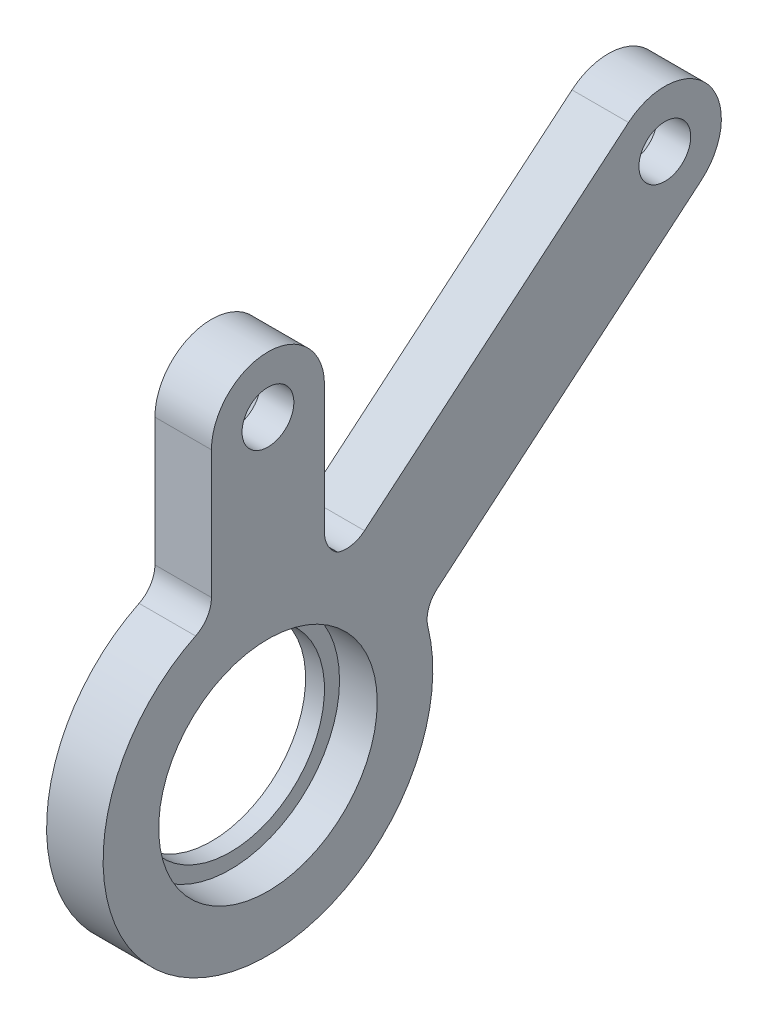
ISO-10303-21;
HEADER;
FILE_DESCRIPTION(('STEP AP214'),'2;1');
FILE_NAME('part.step','',(''),(''),'','','');
FILE_SCHEMA(('AUTOMOTIVE_DESIGN { 1 0 10303 214 1 1 1 1 }'));
ENDSEC;
DATA;
#1=APPLICATION_CONTEXT('core data for automotive mechanical design processes');
#2=APPLICATION_PROTOCOL_DEFINITION('international standard','automotive_design',2000,#1);
#3=PRODUCT_CONTEXT('',#1,'mechanical');
#4=PRODUCT('Part','Part','',(#3));
#5=PRODUCT_RELATED_PRODUCT_CATEGORY('part','',(#4));
#6=PRODUCT_DEFINITION_FORMATION('','',#4);
#7=PRODUCT_DEFINITION_CONTEXT('part definition',#1,'design');
#8=PRODUCT_DEFINITION('design','',#6,#7);
#9=PRODUCT_DEFINITION_SHAPE('','',#8);
#10=(LENGTH_UNIT() NAMED_UNIT(*) SI_UNIT(.MILLI.,.METRE.));
#11=(NAMED_UNIT(*) PLANE_ANGLE_UNIT() SI_UNIT($,.RADIAN.));
#12=(NAMED_UNIT(*) SI_UNIT($,.STERADIAN.) SOLID_ANGLE_UNIT());
#13=UNCERTAINTY_MEASURE_WITH_UNIT(LENGTH_MEASURE(1.E-05),#10,'distance_accuracy_value','');
#14=(GEOMETRIC_REPRESENTATION_CONTEXT(3) GLOBAL_UNCERTAINTY_ASSIGNED_CONTEXT((#13)) GLOBAL_UNIT_ASSIGNED_CONTEXT((#10,
#11,#12)) REPRESENTATION_CONTEXT('',''));
#15=CARTESIAN_POINT('',(0.,0.,0.));
#16=DIRECTION('',(0.,0.,1.));
#17=DIRECTION('',(1.,0.,0.));
#18=AXIS2_PLACEMENT_3D('',#15,#16,#17);
#19=CARTESIAN_POINT('',(-2.,0.,0.));
#20=DIRECTION('',(1.,0.,0.));
#21=DIRECTION('',(0.,0.,-1.));
#22=AXIS2_PLACEMENT_3D('',#19,#20,#21);
#23=CYLINDRICAL_SURFACE('',#22,11.6);
#24=CARTESIAN_POINT('',(4.,0.,0.));
#25=DIRECTION('',(1.,0.,0.));
#26=DIRECTION('',(0.,0.,-1.));
#27=AXIS2_PLACEMENT_3D('',#24,#25,#26);
#28=CIRCLE('',#27,11.6);
#29=CARTESIAN_POINT('',(4.,0.,-11.6));
#30=VERTEX_POINT('',#29);
#31=EDGE_CURVE('E161',#30,#30,#28,.T.);
#32=ORIENTED_EDGE('',*,*,#31,.T.);
#33=EDGE_LOOP('',(#32));
#34=FACE_BOUND('',#33,.T.);
#35=CARTESIAN_POINT('',(0.,0.,0.));
#36=DIRECTION('',(-1.,0.,0.));
#37=DIRECTION('',(0.,0.,1.));
#38=AXIS2_PLACEMENT_3D('',#35,#36,#37);
#39=CIRCLE('',#38,11.6);
#40=CARTESIAN_POINT('',(0.,0.,11.6));
#41=VERTEX_POINT('',#40);
#42=EDGE_CURVE('E11',#41,#41,#39,.F.);
#43=ORIENTED_EDGE('',*,*,#42,.F.);
#44=EDGE_LOOP('',(#43));
#45=FACE_BOUND('',#44,.T.);
#46=ADVANCED_FACE('F35',(#34,#45),#23,.F.);
#47=CARTESIAN_POINT('',(-2.,0.,0.));
#48=DIRECTION('',(1.,0.,0.));
#49=DIRECTION('',(0.,0.,-1.));
#50=AXIS2_PLACEMENT_3D('',#47,#48,#49);
#51=PLANE('',#50);
#52=DIRECTION('',(0.,-1.,0.));
#53=VECTOR('',#52,1.);
#54=CARTESIAN_POINT('',(-2.,0.,-5.99999999999999));
#55=LINE('',#54,#53);
#56=CARTESIAN_POINT('',(-2.,32.,-6.));
#57=VERTEX_POINT('',#56);
#58=CARTESIAN_POINT('',(-2.,18.4187404563939,-6.));
#59=VERTEX_POINT('',#58);
#60=EDGE_CURVE('E132',#57,#59,#55,.T.);
#61=ORIENTED_EDGE('',*,*,#60,.T.);
#62=CARTESIAN_POINT('',(-2.,18.4187404563939,-9.));
#63=DIRECTION('',(1.,0.,0.));
#64=DIRECTION('',(0.,0.,-1.));
#65=AXIS2_PLACEMENT_3D('',#62,#63,#64);
#66=CIRCLE('',#65,3.);
#67=CARTESIAN_POINT('',(-2.,15.8783764006959,-7.40420851471203));
#68=VERTEX_POINT('',#67);
#69=EDGE_CURVE('E58',#59,#68,#66,.T.);
#70=ORIENTED_EDGE('',*,*,#69,.T.);
#71=CARTESIAN_POINT('',(-2.,18.733738139473,-8.32448528869227));
#72=DIRECTION('',(1.,0.,0.));
#73=DIRECTION('',(0.,0.,-1.));
#74=AXIS2_PLACEMENT_3D('',#71,#72,#73);
#75=CIRCLE('',#74,3.);
#76=CARTESIAN_POINT('',(-2.,16.4356048101161,-10.2528481177519));
#77=VERTEX_POINT('',#76);
#78=EDGE_CURVE('E203',#68,#77,#75,.T.);
#79=ORIENTED_EDGE('',*,*,#78,.T.);
#80=DIRECTION('',(0.,-0.642787609686543,0.766044443118975));
#81=VECTOR('',#80,1.);
#82=CARTESIAN_POINT('',(-2.,4.59626665871385,3.85672565811926));
#83=LINE('',#82,#81);
#84=CARTESIAN_POINT('',(-2.,39.9495851914737,-38.2757187134243));
#85=VERTEX_POINT('',#84);
#86=EDGE_CURVE('E158',#85,#77,#83,.T.);
#87=ORIENTED_EDGE('',*,*,#86,.F.);
#88=CARTESIAN_POINT('',(-2.,35.3533185327599,-42.1324443715436));
#89=DIRECTION('',(-1.,0.,0.));
#90=DIRECTION('',(0.,0.,1.));
#91=AXIS2_PLACEMENT_3D('',#88,#89,#90);
#92=CIRCLE('',#91,6.);
#93=CARTESIAN_POINT('',(-2.,30.757051874046,-45.9891700296629));
#94=VERTEX_POINT('',#93);
#95=EDGE_CURVE('E154',#85,#94,#92,.T.);
#96=ORIENTED_EDGE('',*,*,#95,.T.);
#97=DIRECTION('',(0.,-0.642787609686543,0.766044443118975));
#98=VECTOR('',#97,1.);
#99=CARTESIAN_POINT('',(-2.,-4.59626665871384,-3.85672565811925));
#100=LINE('',#99,#98);
#101=CARTESIAN_POINT('',(-2.,7.24307149268841,-17.9662994339904));
#102=VERTEX_POINT('',#101);
#103=EDGE_CURVE('E150',#94,#102,#100,.T.);
#104=ORIENTED_EDGE('',*,*,#103,.T.);
#105=CARTESIAN_POINT('',(-2.,4.94493816333148,-19.8946622630501));
#106=DIRECTION('',(1.,0.,0.));
#107=DIRECTION('',(0.,0.,-1.));
#108=AXIS2_PLACEMENT_3D('',#105,#106,#107);
#109=CIRCLE('',#108,3.);
#110=CARTESIAN_POINT('',(-2.,4.22128867601468,-16.9832482733354));
#111=VERTEX_POINT('',#110);
#112=EDGE_CURVE('E199',#102,#111,#109,.T.);
#113=ORIENTED_EDGE('',*,*,#112,.T.);
#114=CARTESIAN_POINT('',(-2.,0.,0.));
#115=DIRECTION('',(1.,0.,0.));
#116=DIRECTION('',(0.,0.,-1.));
#117=AXIS2_PLACEMENT_3D('',#114,#115,#116);
#118=CIRCLE('',#117,17.5);
#119=CARTESIAN_POINT('',(-2.,15.7233150237509,7.6829268292683));
#120=VERTEX_POINT('',#119);
#121=EDGE_CURVE('E177',#120,#111,#118,.T.);
#122=ORIENTED_EDGE('',*,*,#121,.F.);
#123=CARTESIAN_POINT('',(-2.,18.4187404563939,9.00000000000001));
#124=DIRECTION('',(1.,0.,0.));
#125=DIRECTION('',(0.,0.,-1.));
#126=AXIS2_PLACEMENT_3D('',#123,#124,#125);
#127=CIRCLE('',#126,3.);
#128=CARTESIAN_POINT('',(-2.,18.4187404563939,6.));
#129=VERTEX_POINT('',#128);
#130=EDGE_CURVE('E195',#120,#129,#127,.T.);
#131=ORIENTED_EDGE('',*,*,#130,.T.);
#132=DIRECTION('',(0.,-1.,0.));
#133=VECTOR('',#132,1.);
#134=CARTESIAN_POINT('',(-2.,0.,6.00000000000001));
#135=LINE('',#134,#133);
#136=CARTESIAN_POINT('',(-2.,32.,6.));
#137=VERTEX_POINT('',#136);
#138=EDGE_CURVE('E144',#137,#129,#135,.T.);
#139=ORIENTED_EDGE('',*,*,#138,.F.);
#140=CARTESIAN_POINT('',(-2.,32.,0.));
#141=DIRECTION('',(-1.,0.,0.));
#142=DIRECTION('',(0.,0.,1.));
#143=AXIS2_PLACEMENT_3D('',#140,#141,#142);
#144=CIRCLE('',#143,6.);
#145=EDGE_CURVE('E140',#137,#57,#144,.T.);
#146=ORIENTED_EDGE('',*,*,#145,.T.);
#147=EDGE_LOOP('',(#61,#70,#79,#87,#96,#104,#113,#122,#131,#139,#146));
#148=FACE_BOUND('',#147,.T.);
#149=CARTESIAN_POINT('',(-2.,35.3533185327599,-42.1324443715436));
#150=DIRECTION('',(-1.,0.,0.));
#151=DIRECTION('',(0.,0.,1.));
#152=AXIS2_PLACEMENT_3D('',#149,#150,#151);
#153=CIRCLE('',#152,5.2);
#154=CARTESIAN_POINT('',(-2.,35.3533185327599,-36.9324443715436));
#155=VERTEX_POINT('',#154);
#156=EDGE_CURVE('E229',#155,#155,#153,.T.);
#157=ORIENTED_EDGE('',*,*,#156,.F.);
#158=EDGE_LOOP('',(#157));
#159=FACE_BOUND('',#158,.T.);
#160=CARTESIAN_POINT('',(-2.,32.,0.));
#161=DIRECTION('',(-1.,0.,0.));
#162=DIRECTION('',(0.,0.,1.));
#163=AXIS2_PLACEMENT_3D('',#160,#161,#162);
#164=CIRCLE('',#163,5.2);
#165=CARTESIAN_POINT('',(-2.,32.,5.2));
#166=VERTEX_POINT('',#165);
#167=EDGE_CURVE('E209',#166,#166,#164,.T.);
#168=ORIENTED_EDGE('',*,*,#167,.F.);
#169=EDGE_LOOP('',(#168));
#170=FACE_BOUND('',#169,.T.);
#171=CARTESIAN_POINT('',(-2.,0.,0.));
#172=DIRECTION('',(-1.,0.,0.));
#173=DIRECTION('',(0.,0.,1.));
#174=AXIS2_PLACEMENT_3D('',#171,#172,#173);
#175=CIRCLE('',#174,10.);
#176=CARTESIAN_POINT('',(-2.,0.,10.));
#177=VERTEX_POINT('',#176);
#178=EDGE_CURVE('E217',#177,#177,#175,.T.);
#179=ORIENTED_EDGE('',*,*,#178,.F.);
#180=EDGE_LOOP('',(#179));
#181=FACE_BOUND('',#180,.T.);
#182=ADVANCED_FACE('F237',(#148,#159,#170,#181),#51,.F.);
#183=CARTESIAN_POINT('',(-2.,0.,0.));
#184=DIRECTION('',(1.,0.,0.));
#185=DIRECTION('',(0.,0.,-1.));
#186=AXIS2_PLACEMENT_3D('',#183,#184,#185);
#187=CYLINDRICAL_SURFACE('',#186,17.5);
#188=CARTESIAN_POINT('',(4.,0.,0.));
#189=DIRECTION('',(1.,0.,0.));
#190=DIRECTION('',(0.,0.,-1.));
#191=AXIS2_PLACEMENT_3D('',#188,#189,#190);
#192=CIRCLE('',#191,17.5);
#193=CARTESIAN_POINT('',(4.,15.7233150237509,7.6829268292683));
#194=VERTEX_POINT('',#193);
#195=CARTESIAN_POINT('',(4.,4.22128867601468,-16.9832482733354));
#196=VERTEX_POINT('',#195);
#197=EDGE_CURVE('E174',#194,#196,#192,.T.);
#198=ORIENTED_EDGE('',*,*,#197,.F.);
#199=DIRECTION('',(1.,0.,0.));
#200=VECTOR('',#199,1.);
#201=CARTESIAN_POINT('',(-2.,15.7233150237509,7.6829268292683));
#202=LINE('',#201,#200);
#203=EDGE_CURVE('E182',#194,#120,#202,.F.);
#204=ORIENTED_EDGE('',*,*,#203,.T.);
#205=ORIENTED_EDGE('',*,*,#121,.T.);
#206=DIRECTION('',(1.,0.,0.));
#207=VECTOR('',#206,1.);
#208=CARTESIAN_POINT('',(-2.,4.22128867601468,-16.9832482733354));
#209=LINE('',#208,#207);
#210=EDGE_CURVE('E180',#111,#196,#209,.T.);
#211=ORIENTED_EDGE('',*,*,#210,.T.);
#212=EDGE_LOOP('',(#198,#204,#205,#211));
#213=FACE_BOUND('',#212,.T.);
#214=ADVANCED_FACE('F251',(#213),#187,.T.);
#215=CARTESIAN_POINT('',(4.,0.,0.));
#216=DIRECTION('',(1.,0.,0.));
#217=DIRECTION('',(0.,0.,-1.));
#218=AXIS2_PLACEMENT_3D('',#215,#216,#217);
#219=PLANE('',#218);
#220=CARTESIAN_POINT('',(4.,32.,0.));
#221=DIRECTION('',(1.,0.,0.));
#222=DIRECTION('',(0.,0.,-1.));
#223=AXIS2_PLACEMENT_3D('',#220,#221,#222);
#224=CIRCLE('',#223,2.75);
#225=CARTESIAN_POINT('',(4.,32.,-2.75));
#226=VERTEX_POINT('',#225);
#227=EDGE_CURVE('E226',#226,#226,#224,.T.);
#228=ORIENTED_EDGE('',*,*,#227,.F.);
#229=EDGE_LOOP('',(#228));
#230=FACE_BOUND('',#229,.T.);
#231=CARTESIAN_POINT('',(4.,35.3533185327599,-42.1324443715436));
#232=DIRECTION('',(1.,0.,0.));
#233=DIRECTION('',(0.,0.,-1.));
#234=AXIS2_PLACEMENT_3D('',#231,#232,#233);
#235=CIRCLE('',#234,2.75);
#236=CARTESIAN_POINT('',(4.,35.3533185327599,-44.8824443715436));
#237=VERTEX_POINT('',#236);
#238=EDGE_CURVE('E147',#237,#237,#235,.T.);
#239=ORIENTED_EDGE('',*,*,#238,.F.);
#240=EDGE_LOOP('',(#239));
#241=FACE_BOUND('',#240,.T.);
#242=CARTESIAN_POINT('',(4.,18.733738139473,-8.32448528869227));
#243=DIRECTION('',(1.,0.,0.));
#244=DIRECTION('',(0.,0.,-1.));
#245=AXIS2_PLACEMENT_3D('',#242,#243,#244);
#246=CIRCLE('',#245,3.);
#247=CARTESIAN_POINT('',(4.,16.4356048101161,-10.2528481177519));
#248=VERTEX_POINT('',#247);
#249=CARTESIAN_POINT('',(4.,15.8783764006959,-7.40420851471203));
#250=VERTEX_POINT('',#249);
#251=EDGE_CURVE('E50',#248,#250,#246,.F.);
#252=ORIENTED_EDGE('',*,*,#251,.T.);
#253=CARTESIAN_POINT('',(4.,18.4187404563939,-9.));
#254=DIRECTION('',(1.,0.,0.));
#255=DIRECTION('',(0.,0.,-1.));
#256=AXIS2_PLACEMENT_3D('',#253,#254,#255);
#257=CIRCLE('',#256,3.);
#258=CARTESIAN_POINT('',(4.,18.4187404563939,-6.));
#259=VERTEX_POINT('',#258);
#260=EDGE_CURVE('E43',#250,#259,#257,.F.);
#261=ORIENTED_EDGE('',*,*,#260,.T.);
#262=DIRECTION('',(0.,-1.,0.));
#263=VECTOR('',#262,1.);
#264=CARTESIAN_POINT('',(4.,0.,-5.99999999999999));
#265=LINE('',#264,#263);
#266=CARTESIAN_POINT('',(4.,32.,-6.));
#267=VERTEX_POINT('',#266);
#268=EDGE_CURVE('E117',#267,#259,#265,.T.);
#269=ORIENTED_EDGE('',*,*,#268,.F.);
#270=CARTESIAN_POINT('',(4.,32.,0.));
#271=DIRECTION('',(1.,0.,0.));
#272=DIRECTION('',(0.,0.,-1.));
#273=AXIS2_PLACEMENT_3D('',#270,#271,#272);
#274=CIRCLE('',#273,6.);
#275=CARTESIAN_POINT('',(4.,32.,6.));
#276=VERTEX_POINT('',#275);
#277=EDGE_CURVE('E123',#276,#267,#274,.F.);
#278=ORIENTED_EDGE('',*,*,#277,.F.);
#279=DIRECTION('',(0.,-1.,0.));
#280=VECTOR('',#279,1.);
#281=CARTESIAN_POINT('',(4.,0.,6.00000000000001));
#282=LINE('',#281,#280);
#283=CARTESIAN_POINT('',(4.,18.4187404563939,6.));
#284=VERTEX_POINT('',#283);
#285=EDGE_CURVE('E146',#276,#284,#282,.T.);
#286=ORIENTED_EDGE('',*,*,#285,.T.);
#287=CARTESIAN_POINT('',(4.,18.4187404563939,9.00000000000001));
#288=DIRECTION('',(1.,0.,0.));
#289=DIRECTION('',(0.,0.,-1.));
#290=AXIS2_PLACEMENT_3D('',#287,#288,#289);
#291=CIRCLE('',#290,3.);
#292=EDGE_CURVE('E197',#284,#194,#291,.F.);
#293=ORIENTED_EDGE('',*,*,#292,.T.);
#294=ORIENTED_EDGE('',*,*,#197,.T.);
#295=CARTESIAN_POINT('',(4.,4.94493816333148,-19.8946622630501));
#296=DIRECTION('',(1.,0.,0.));
#297=DIRECTION('',(0.,0.,-1.));
#298=AXIS2_PLACEMENT_3D('',#295,#296,#297);
#299=CIRCLE('',#298,3.);
#300=CARTESIAN_POINT('',(4.,7.24307149268841,-17.9662994339904));
#301=VERTEX_POINT('',#300);
#302=EDGE_CURVE('E201',#196,#301,#299,.F.);
#303=ORIENTED_EDGE('',*,*,#302,.T.);
#304=DIRECTION('',(0.,-0.642787609686543,0.766044443118975));
#305=VECTOR('',#304,1.);
#306=CARTESIAN_POINT('',(4.,-4.59626665871384,-3.85672565811925));
#307=LINE('',#306,#305);
#308=CARTESIAN_POINT('',(4.,30.757051874046,-45.9891700296629));
#309=VERTEX_POINT('',#308);
#310=EDGE_CURVE('E167',#309,#301,#307,.T.);
#311=ORIENTED_EDGE('',*,*,#310,.F.);
#312=CARTESIAN_POINT('',(4.,35.3533185327599,-42.1324443715436));
#313=DIRECTION('',(1.,0.,0.));
#314=DIRECTION('',(0.,0.,-1.));
#315=AXIS2_PLACEMENT_3D('',#312,#313,#314);
#316=CIRCLE('',#315,6.);
#317=CARTESIAN_POINT('',(4.,39.9495851914737,-38.2757187134243));
#318=VERTEX_POINT('',#317);
#319=EDGE_CURVE('E153',#318,#309,#316,.F.);
#320=ORIENTED_EDGE('',*,*,#319,.F.);
#321=DIRECTION('',(0.,-0.642787609686543,0.766044443118975));
#322=VECTOR('',#321,1.);
#323=CARTESIAN_POINT('',(4.,4.59626665871385,3.85672565811926));
#324=LINE('',#323,#322);
#325=EDGE_CURVE('E157',#318,#248,#324,.T.);
#326=ORIENTED_EDGE('',*,*,#325,.T.);
#327=EDGE_LOOP('',(#252,#261,#269,#278,#286,#293,#294,#303,#311,#320,#326));
#328=FACE_BOUND('',#327,.T.);
#329=ORIENTED_EDGE('',*,*,#31,.F.);
#330=EDGE_LOOP('',(#329));
#331=FACE_BOUND('',#330,.T.);
#332=ADVANCED_FACE('F119',(#230,#241,#328,#331),#219,.T.);
#333=CARTESIAN_POINT('',(56.9525305480915,35.3533185327599,-42.1324443715436));
#334=DIRECTION('',(-1.,0.,0.));
#335=DIRECTION('',(0.,0.,1.));
#336=AXIS2_PLACEMENT_3D('',#333,#334,#335);
#337=CYLINDRICAL_SURFACE('',#336,6.);
#338=DIRECTION('',(-1.,0.,0.));
#339=VECTOR('',#338,1.);
#340=CARTESIAN_POINT('',(56.9525305480915,39.9495851914737,-38.2757187134243));
#341=LINE('',#340,#339);
#342=EDGE_CURVE('E162',#318,#85,#341,.T.);
#343=ORIENTED_EDGE('',*,*,#342,.F.);
#344=ORIENTED_EDGE('',*,*,#319,.T.);
#345=DIRECTION('',(-1.,0.,0.));
#346=VECTOR('',#345,1.);
#347=CARTESIAN_POINT('',(56.9525305480915,30.757051874046,-45.9891700296629));
#348=LINE('',#347,#346);
#349=EDGE_CURVE('E165',#309,#94,#348,.T.);
#350=ORIENTED_EDGE('',*,*,#349,.T.);
#351=ORIENTED_EDGE('',*,*,#95,.F.);
#352=EDGE_LOOP('',(#343,#344,#350,#351));
#353=FACE_BOUND('',#352,.T.);
#354=ADVANCED_FACE('F263',(#353),#337,.T.);
#355=CARTESIAN_POINT('',(56.9525305480915,-4.59626665871384,-3.85672565811925));
#356=DIRECTION('',(0.,-0.766044443118975,-0.642787609686543));
#357=DIRECTION('',(0.,0.642787609686543,-0.766044443118975));
#358=AXIS2_PLACEMENT_3D('',#355,#356,#357);
#359=PLANE('',#358);
#360=ORIENTED_EDGE('',*,*,#310,.T.);
#361=DIRECTION('',(-1.,0.,0.));
#362=VECTOR('',#361,1.);
#363=CARTESIAN_POINT('',(-2.,7.2430714926884,-17.9662994339904));
#364=LINE('',#363,#362);
#365=EDGE_CURVE('E187',#301,#102,#364,.T.);
#366=ORIENTED_EDGE('',*,*,#365,.T.);
#367=ORIENTED_EDGE('',*,*,#103,.F.);
#368=ORIENTED_EDGE('',*,*,#349,.F.);
#369=EDGE_LOOP('',(#360,#366,#367,#368));
#370=FACE_BOUND('',#369,.T.);
#371=ADVANCED_FACE('F258',(#370),#359,.T.);
#372=CARTESIAN_POINT('',(56.9525305480915,4.59626665871385,3.85672565811926));
#373=DIRECTION('',(0.,-0.766044443118975,-0.642787609686543));
#374=DIRECTION('',(0.,0.642787609686543,-0.766044443118975));
#375=AXIS2_PLACEMENT_3D('',#372,#373,#374);
#376=PLANE('',#375);
#377=ORIENTED_EDGE('',*,*,#86,.T.);
#378=DIRECTION('',(1.,0.,0.));
#379=VECTOR('',#378,1.);
#380=CARTESIAN_POINT('',(56.9525305480915,16.4356048101161,-10.2528481177519));
#381=LINE('',#380,#379);
#382=EDGE_CURVE('E190',#77,#248,#381,.T.);
#383=ORIENTED_EDGE('',*,*,#382,.T.);
#384=ORIENTED_EDGE('',*,*,#325,.F.);
#385=ORIENTED_EDGE('',*,*,#342,.T.);
#386=EDGE_LOOP('',(#377,#383,#384,#385));
#387=FACE_BOUND('',#386,.T.);
#388=ADVANCED_FACE('F266',(#387),#376,.F.);
#389=CARTESIAN_POINT('',(56.9525305480915,32.,0.));
#390=DIRECTION('',(-1.,0.,0.));
#391=DIRECTION('',(0.,0.,1.));
#392=AXIS2_PLACEMENT_3D('',#389,#390,#391);
#393=CYLINDRICAL_SURFACE('',#392,6.);
#394=DIRECTION('',(-1.,0.,0.));
#395=VECTOR('',#394,1.);
#396=CARTESIAN_POINT('',(56.9525305480915,32.,6.));
#397=LINE('',#396,#395);
#398=EDGE_CURVE('E127',#276,#137,#397,.T.);
#399=ORIENTED_EDGE('',*,*,#398,.F.);
#400=ORIENTED_EDGE('',*,*,#277,.T.);
#401=DIRECTION('',(-1.,0.,0.));
#402=VECTOR('',#401,1.);
#403=CARTESIAN_POINT('',(56.9525305480915,32.,-6.));
#404=LINE('',#403,#402);
#405=EDGE_CURVE('E128',#267,#57,#404,.T.);
#406=ORIENTED_EDGE('',*,*,#405,.T.);
#407=ORIENTED_EDGE('',*,*,#145,.F.);
#408=EDGE_LOOP('',(#399,#400,#406,#407));
#409=FACE_BOUND('',#408,.T.);
#410=ADVANCED_FACE('F138',(#409),#393,.T.);
#411=CARTESIAN_POINT('',(56.9525305480915,0.,-5.99999999999999));
#412=DIRECTION('',(0.,0.,-1.));
#413=DIRECTION('',(0.,1.,0.));
#414=AXIS2_PLACEMENT_3D('',#411,#412,#413);
#415=PLANE('',#414);
#416=ORIENTED_EDGE('',*,*,#268,.T.);
#417=DIRECTION('',(-1.,0.,0.));
#418=VECTOR('',#417,1.);
#419=CARTESIAN_POINT('',(-2.,18.4187404563939,-6.));
#420=LINE('',#419,#418);
#421=EDGE_CURVE('E193',#259,#59,#420,.T.);
#422=ORIENTED_EDGE('',*,*,#421,.T.);
#423=ORIENTED_EDGE('',*,*,#60,.F.);
#424=ORIENTED_EDGE('',*,*,#405,.F.);
#425=EDGE_LOOP('',(#416,#422,#423,#424));
#426=FACE_BOUND('',#425,.T.);
#427=ADVANCED_FACE('F131',(#426),#415,.T.);
#428=CARTESIAN_POINT('',(56.9525305480915,0.,6.00000000000001));
#429=DIRECTION('',(0.,0.,-1.));
#430=DIRECTION('',(0.,1.,0.));
#431=AXIS2_PLACEMENT_3D('',#428,#429,#430);
#432=PLANE('',#431);
#433=ORIENTED_EDGE('',*,*,#138,.T.);
#434=DIRECTION('',(1.,0.,0.));
#435=VECTOR('',#434,1.);
#436=CARTESIAN_POINT('',(56.9525305480915,18.4187404563939,6.));
#437=LINE('',#436,#435);
#438=EDGE_CURVE('E185',#129,#284,#437,.T.);
#439=ORIENTED_EDGE('',*,*,#438,.T.);
#440=ORIENTED_EDGE('',*,*,#285,.F.);
#441=ORIENTED_EDGE('',*,*,#398,.T.);
#442=EDGE_LOOP('',(#433,#439,#440,#441));
#443=FACE_BOUND('',#442,.T.);
#444=ADVANCED_FACE('F243',(#443),#432,.F.);
#445=CARTESIAN_POINT('',(-2.,35.3533185327599,-42.1324443715436));
#446=DIRECTION('',(-1.,0.,0.));
#447=DIRECTION('',(0.,0.,1.));
#448=AXIS2_PLACEMENT_3D('',#445,#446,#447);
#449=CYLINDRICAL_SURFACE('',#448,2.75);
#450=CARTESIAN_POINT('',(0.450000000000001,35.3533185327599,-42.1324443715436));
#451=DIRECTION('',(-1.,0.,0.));
#452=DIRECTION('',(0.,0.,1.));
#453=AXIS2_PLACEMENT_3D('',#450,#451,#452);
#454=CIRCLE('',#453,2.75);
#455=CARTESIAN_POINT('',(0.450000000000001,35.3533185327599,-39.3824443715436));
#456=VERTEX_POINT('',#455);
#457=EDGE_CURVE('E232',#456,#456,#454,.T.);
#458=ORIENTED_EDGE('',*,*,#457,.T.);
#459=EDGE_LOOP('',(#458));
#460=FACE_BOUND('',#459,.T.);
#461=ORIENTED_EDGE('',*,*,#238,.T.);
#462=EDGE_LOOP('',(#461));
#463=FACE_BOUND('',#462,.T.);
#464=ADVANCED_FACE('F350',(#460,#463),#449,.F.);
#465=CARTESIAN_POINT('',(-2.,35.3533185327599,-42.1324443715436));
#466=DIRECTION('',(-1.,0.,0.));
#467=DIRECTION('',(0.,0.,1.));
#468=AXIS2_PLACEMENT_3D('',#465,#466,#467);
#469=CONICAL_SURFACE('',#468,5.2,0.785398163397448);
#470=ORIENTED_EDGE('',*,*,#457,.F.);
#471=EDGE_LOOP('',(#470));
#472=FACE_BOUND('',#471,.T.);
#473=ORIENTED_EDGE('',*,*,#156,.T.);
#474=EDGE_LOOP('',(#473));
#475=FACE_BOUND('',#474,.T.);
#476=ADVANCED_FACE('F346',(#472,#475),#469,.F.);
#477=CARTESIAN_POINT('',(-2.,32.,0.));
#478=DIRECTION('',(-1.,0.,0.));
#479=DIRECTION('',(0.,0.,1.));
#480=AXIS2_PLACEMENT_3D('',#477,#478,#479);
#481=CYLINDRICAL_SURFACE('',#480,2.75);
#482=CARTESIAN_POINT('',(0.450000000000001,32.,0.));
#483=DIRECTION('',(-1.,0.,0.));
#484=DIRECTION('',(0.,0.,1.));
#485=AXIS2_PLACEMENT_3D('',#482,#483,#484);
#486=CIRCLE('',#485,2.75);
#487=CARTESIAN_POINT('',(0.450000000000001,32.,2.75));
#488=VERTEX_POINT('',#487);
#489=EDGE_CURVE('E214',#488,#488,#486,.T.);
#490=ORIENTED_EDGE('',*,*,#489,.T.);
#491=EDGE_LOOP('',(#490));
#492=FACE_BOUND('',#491,.T.);
#493=ORIENTED_EDGE('',*,*,#227,.T.);
#494=EDGE_LOOP('',(#493));
#495=FACE_BOUND('',#494,.T.);
#496=ADVANCED_FACE('F342',(#492,#495),#481,.F.);
#497=CARTESIAN_POINT('',(-2.,32.,0.));
#498=DIRECTION('',(-1.,0.,0.));
#499=DIRECTION('',(0.,0.,1.));
#500=AXIS2_PLACEMENT_3D('',#497,#498,#499);
#501=CONICAL_SURFACE('',#500,5.2,0.785398163397448);
#502=ORIENTED_EDGE('',*,*,#489,.F.);
#503=EDGE_LOOP('',(#502));
#504=FACE_BOUND('',#503,.T.);
#505=ORIENTED_EDGE('',*,*,#167,.T.);
#506=EDGE_LOOP('',(#505));
#507=FACE_BOUND('',#506,.T.);
#508=ADVANCED_FACE('F294',(#504,#507),#501,.F.);
#509=CARTESIAN_POINT('',(-2.,18.4187404563939,9.00000000000001));
#510=DIRECTION('',(1.,0.,0.));
#511=DIRECTION('',(0.,0.,-1.));
#512=AXIS2_PLACEMENT_3D('',#509,#510,#511);
#513=CYLINDRICAL_SURFACE('',#512,3.);
#514=ORIENTED_EDGE('',*,*,#292,.F.);
#515=ORIENTED_EDGE('',*,*,#438,.F.);
#516=ORIENTED_EDGE('',*,*,#130,.F.);
#517=ORIENTED_EDGE('',*,*,#203,.F.);
#518=EDGE_LOOP('',(#514,#515,#516,#517));
#519=FACE_BOUND('',#518,.T.);
#520=ADVANCED_FACE('F246',(#519),#513,.F.);
#521=CARTESIAN_POINT('',(-2.,4.94493816333148,-19.8946622630501));
#522=DIRECTION('',(1.,0.,0.));
#523=DIRECTION('',(0.,0.,-1.));
#524=AXIS2_PLACEMENT_3D('',#521,#522,#523);
#525=CYLINDRICAL_SURFACE('',#524,3.);
#526=ORIENTED_EDGE('',*,*,#302,.F.);
#527=ORIENTED_EDGE('',*,*,#210,.F.);
#528=ORIENTED_EDGE('',*,*,#112,.F.);
#529=ORIENTED_EDGE('',*,*,#365,.F.);
#530=EDGE_LOOP('',(#526,#527,#528,#529));
#531=FACE_BOUND('',#530,.T.);
#532=ADVANCED_FACE('F254',(#531),#525,.F.);
#533=CARTESIAN_POINT('',(-2.,18.4187404563939,-9.));
#534=DIRECTION('',(1.,0.,0.));
#535=DIRECTION('',(0.,0.,-1.));
#536=AXIS2_PLACEMENT_3D('',#533,#534,#535);
#537=CYLINDRICAL_SURFACE('',#536,3.);
#538=ORIENTED_EDGE('',*,*,#421,.F.);
#539=ORIENTED_EDGE('',*,*,#260,.F.);
#540=DIRECTION('',(1.,0.,0.));
#541=VECTOR('',#540,1.);
#542=CARTESIAN_POINT('',(1.,15.8783764006959,-7.40420851471202));
#543=LINE('',#542,#541);
#544=EDGE_CURVE('E207',#68,#250,#543,.T.);
#545=ORIENTED_EDGE('',*,*,#544,.F.);
#546=ORIENTED_EDGE('',*,*,#69,.F.);
#547=EDGE_LOOP('',(#538,#539,#545,#546));
#548=FACE_BOUND('',#547,.T.);
#549=ADVANCED_FACE('F37',(#548),#537,.F.);
#550=CARTESIAN_POINT('',(-2.,18.733738139473,-8.32448528869227));
#551=DIRECTION('',(1.,0.,0.));
#552=DIRECTION('',(0.,0.,-1.));
#553=AXIS2_PLACEMENT_3D('',#550,#551,#552);
#554=CYLINDRICAL_SURFACE('',#553,3.);
#555=ORIENTED_EDGE('',*,*,#251,.F.);
#556=ORIENTED_EDGE('',*,*,#382,.F.);
#557=ORIENTED_EDGE('',*,*,#78,.F.);
#558=ORIENTED_EDGE('',*,*,#544,.T.);
#559=EDGE_LOOP('',(#555,#556,#557,#558));
#560=FACE_BOUND('',#559,.T.);
#561=ADVANCED_FACE('F269',(#560),#554,.F.);
#562=CARTESIAN_POINT('',(0.,0.,0.));
#563=DIRECTION('',(-1.,0.,0.));
#564=DIRECTION('',(0.,0.,1.));
#565=AXIS2_PLACEMENT_3D('',#562,#563,#564);
#566=PLANE('',#565);
#567=CARTESIAN_POINT('',(0.,0.,0.));
#568=DIRECTION('',(-1.,0.,0.));
#569=DIRECTION('',(0.,0.,1.));
#570=AXIS2_PLACEMENT_3D('',#567,#568,#569);
#571=CIRCLE('',#570,10.);
#572=CARTESIAN_POINT('',(0.,0.,10.));
#573=VERTEX_POINT('',#572);
#574=EDGE_CURVE('E210',#573,#573,#571,.T.);
#575=ORIENTED_EDGE('',*,*,#574,.T.);
#576=EDGE_LOOP('',(#575));
#577=FACE_BOUND('',#576,.T.);
#578=ORIENTED_EDGE('',*,*,#42,.T.);
#579=EDGE_LOOP('',(#578));
#580=FACE_BOUND('',#579,.T.);
#581=ADVANCED_FACE('F271',(#577,#580),#566,.F.);
#582=CARTESIAN_POINT('',(0.,0.,0.));
#583=DIRECTION('',(-1.,0.,0.));
#584=DIRECTION('',(0.,0.,1.));
#585=AXIS2_PLACEMENT_3D('',#582,#583,#584);
#586=CYLINDRICAL_SURFACE('',#585,10.);
#587=ORIENTED_EDGE('',*,*,#574,.F.);
#588=EDGE_LOOP('',(#587));
#589=FACE_BOUND('',#588,.T.);
#590=ORIENTED_EDGE('',*,*,#178,.T.);
#591=EDGE_LOOP('',(#590));
#592=FACE_BOUND('',#591,.T.);
#593=ADVANCED_FACE('F276',(#589,#592),#586,.F.);
#594=CLOSED_SHELL('',(#46,#182,#214,#332,#354,#371,#388,#410,#427,#444,#464,#476,#496,#508,#520,
#532,#549,#561,#581,#593));
#595=MANIFOLD_SOLID_BREP('B2',#594);
#596=ADVANCED_BREP_SHAPE_REPRESENTATION('',(#18,#595),#14);
#597=SHAPE_DEFINITION_REPRESENTATION(#9,#596);
ENDSEC;
END-ISO-10303-21;
